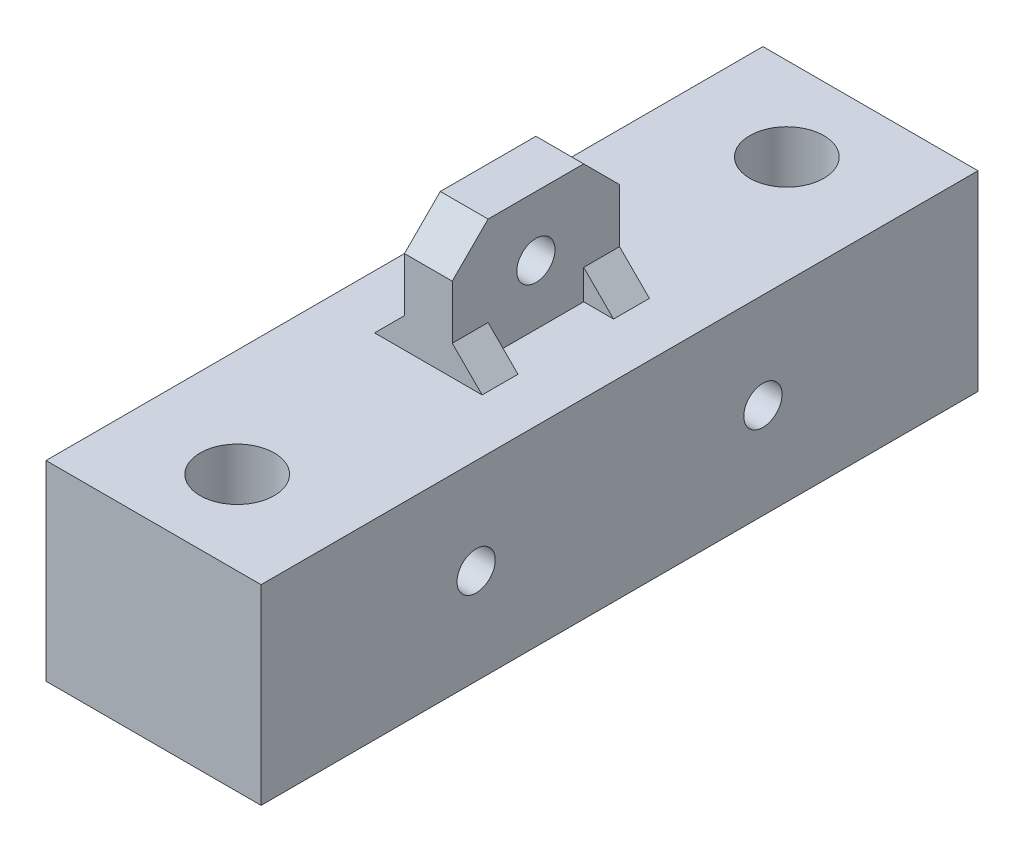
ISO-10303-21;
HEADER;
FILE_DESCRIPTION(('STEP AP214'),'2;1');
FILE_NAME('part.step','',(''),(''),'','','');
FILE_SCHEMA(('AUTOMOTIVE_DESIGN { 1 0 10303 214 1 1 1 1 }'));
ENDSEC;
DATA;
#1=APPLICATION_CONTEXT('core data for automotive mechanical design processes');
#2=APPLICATION_PROTOCOL_DEFINITION('international standard','automotive_design',2000,#1);
#3=PRODUCT_CONTEXT('',#1,'mechanical');
#4=PRODUCT('Part','Part','',(#3));
#5=PRODUCT_RELATED_PRODUCT_CATEGORY('part','',(#4));
#6=PRODUCT_DEFINITION_FORMATION('','',#4);
#7=PRODUCT_DEFINITION_CONTEXT('part definition',#1,'design');
#8=PRODUCT_DEFINITION('design','',#6,#7);
#9=PRODUCT_DEFINITION_SHAPE('','',#8);
#10=(LENGTH_UNIT() NAMED_UNIT(*) SI_UNIT(.MILLI.,.METRE.));
#11=(NAMED_UNIT(*) PLANE_ANGLE_UNIT() SI_UNIT($,.RADIAN.));
#12=(NAMED_UNIT(*) SI_UNIT($,.STERADIAN.) SOLID_ANGLE_UNIT());
#13=UNCERTAINTY_MEASURE_WITH_UNIT(LENGTH_MEASURE(1.E-05),#10,'distance_accuracy_value','');
#14=(GEOMETRIC_REPRESENTATION_CONTEXT(3) GLOBAL_UNCERTAINTY_ASSIGNED_CONTEXT((#13)) GLOBAL_UNIT_ASSIGNED_CONTEXT((#10,
#11,#12)) REPRESENTATION_CONTEXT('',''));
#15=CARTESIAN_POINT('',(0.,0.,0.));
#16=DIRECTION('',(0.,0.,1.));
#17=DIRECTION('',(1.,0.,0.));
#18=AXIS2_PLACEMENT_3D('',#15,#16,#17);
#19=CARTESIAN_POINT('',(0.,16.,0.));
#20=DIRECTION('',(0.,-1.,0.));
#21=DIRECTION('',(0.,0.,-1.));
#22=AXIS2_PLACEMENT_3D('',#19,#20,#21);
#23=PLANE('',#22);
#24=DIRECTION('',(0.,0.,-1.));
#25=VECTOR('',#24,1.);
#26=CARTESIAN_POINT('',(9.,16.,30.));
#27=LINE('',#26,#25);
#28=CARTESIAN_POINT('',(9.,16.,30.));
#29=VERTEX_POINT('',#28);
#30=CARTESIAN_POINT('',(9.,16.,-30.));
#31=VERTEX_POINT('',#30);
#32=EDGE_CURVE('E235',#29,#31,#27,.T.);
#33=ORIENTED_EDGE('',*,*,#32,.T.);
#34=DIRECTION('',(-1.,0.,0.));
#35=VECTOR('',#34,1.);
#36=CARTESIAN_POINT('',(-9.,16.,-30.));
#37=LINE('',#36,#35);
#38=CARTESIAN_POINT('',(-9.,16.,-30.));
#39=VERTEX_POINT('',#38);
#40=EDGE_CURVE('E234',#31,#39,#37,.T.);
#41=ORIENTED_EDGE('',*,*,#40,.T.);
#42=DIRECTION('',(0.,0.,1.));
#43=VECTOR('',#42,1.);
#44=CARTESIAN_POINT('',(-9.,16.,30.));
#45=LINE('',#44,#43);
#46=CARTESIAN_POINT('',(-9.,16.,30.));
#47=VERTEX_POINT('',#46);
#48=EDGE_CURVE('E236',#39,#47,#45,.T.);
#49=ORIENTED_EDGE('',*,*,#48,.T.);
#50=DIRECTION('',(1.,0.,0.));
#51=VECTOR('',#50,1.);
#52=CARTESIAN_POINT('',(-9.,16.,30.));
#53=LINE('',#52,#51);
#54=EDGE_CURVE('E238',#47,#29,#53,.T.);
#55=ORIENTED_EDGE('',*,*,#54,.T.);
#56=EDGE_LOOP('',(#33,#41,#49,#55));
#57=FACE_BOUND('',#56,.T.);
#58=CARTESIAN_POINT('',(0.,16.,23.));
#59=DIRECTION('',(0.,1.,0.));
#60=DIRECTION('',(0.,0.,1.));
#61=AXIS2_PLACEMENT_3D('',#58,#59,#60);
#62=CIRCLE('',#61,3.1);
#63=CARTESIAN_POINT('',(0.,16.,26.1));
#64=VERTEX_POINT('',#63);
#65=EDGE_CURVE('E211',#64,#64,#62,.T.);
#66=ORIENTED_EDGE('',*,*,#65,.F.);
#67=EDGE_LOOP('',(#66));
#68=FACE_BOUND('',#67,.T.);
#69=CARTESIAN_POINT('',(0.,16.,-23.));
#70=DIRECTION('',(0.,1.,0.));
#71=DIRECTION('',(0.,0.,1.));
#72=AXIS2_PLACEMENT_3D('',#69,#70,#71);
#73=CIRCLE('',#72,3.1);
#74=CARTESIAN_POINT('',(0.,16.,-19.9));
#75=VERTEX_POINT('',#74);
#76=EDGE_CURVE('E221',#75,#75,#73,.T.);
#77=ORIENTED_EDGE('',*,*,#76,.F.);
#78=EDGE_LOOP('',(#77));
#79=FACE_BOUND('',#78,.T.);
#80=DIRECTION('',(-1.,0.,0.));
#81=VECTOR('',#80,1.);
#82=CARTESIAN_POINT('',(4.5,16.,-4.));
#83=LINE('',#82,#81);
#84=CARTESIAN_POINT('',(4.5,16.,-4.));
#85=VERTEX_POINT('',#84);
#86=CARTESIAN_POINT('',(2.,16.,-4.));
#87=VERTEX_POINT('',#86);
#88=EDGE_CURVE('E168',#85,#87,#83,.T.);
#89=ORIENTED_EDGE('',*,*,#88,.T.);
#90=DIRECTION('',(0.,0.,-1.));
#91=VECTOR('',#90,1.);
#92=CARTESIAN_POINT('',(2.,16.,7.));
#93=LINE('',#92,#91);
#94=CARTESIAN_POINT('',(2.,16.,4.));
#95=VERTEX_POINT('',#94);
#96=EDGE_CURVE('E177',#95,#87,#93,.T.);
#97=ORIENTED_EDGE('',*,*,#96,.F.);
#98=DIRECTION('',(1.,0.,0.));
#99=VECTOR('',#98,1.);
#100=CARTESIAN_POINT('',(4.5,16.,4.));
#101=LINE('',#100,#99);
#102=CARTESIAN_POINT('',(4.5,16.,4.));
#103=VERTEX_POINT('',#102);
#104=EDGE_CURVE('E326',#95,#103,#101,.T.);
#105=ORIENTED_EDGE('',*,*,#104,.T.);
#106=DIRECTION('',(0.,0.,1.));
#107=VECTOR('',#106,1.);
#108=CARTESIAN_POINT('',(4.5,16.,4.));
#109=LINE('',#108,#107);
#110=CARTESIAN_POINT('',(4.5,16.,7.));
#111=VERTEX_POINT('',#110);
#112=EDGE_CURVE('E332',#103,#111,#109,.T.);
#113=ORIENTED_EDGE('',*,*,#112,.T.);
#114=DIRECTION('',(1.,0.,0.));
#115=VECTOR('',#114,1.);
#116=CARTESIAN_POINT('',(-2.,16.,7.));
#117=LINE('',#116,#115);
#118=CARTESIAN_POINT('',(-4.5,16.,7.));
#119=VERTEX_POINT('',#118);
#120=EDGE_CURVE('E190',#119,#111,#117,.T.);
#121=ORIENTED_EDGE('',*,*,#120,.F.);
#122=DIRECTION('',(0.,0.,1.));
#123=VECTOR('',#122,1.);
#124=CARTESIAN_POINT('',(-4.5,16.,4.));
#125=LINE('',#124,#123);
#126=CARTESIAN_POINT('',(-4.5,16.,4.));
#127=VERTEX_POINT('',#126);
#128=EDGE_CURVE('E346',#127,#119,#125,.T.);
#129=ORIENTED_EDGE('',*,*,#128,.F.);
#130=DIRECTION('',(1.,0.,0.));
#131=VECTOR('',#130,1.);
#132=CARTESIAN_POINT('',(-4.5,16.,4.));
#133=LINE('',#132,#131);
#134=CARTESIAN_POINT('',(-2.,16.,4.));
#135=VERTEX_POINT('',#134);
#136=EDGE_CURVE('E308',#127,#135,#133,.T.);
#137=ORIENTED_EDGE('',*,*,#136,.T.);
#138=DIRECTION('',(0.,0.,-1.));
#139=VECTOR('',#138,1.);
#140=CARTESIAN_POINT('',(-2.,16.,7.));
#141=LINE('',#140,#139);
#142=CARTESIAN_POINT('',(-2.,16.,-4.));
#143=VERTEX_POINT('',#142);
#144=EDGE_CURVE('E195',#135,#143,#141,.T.);
#145=ORIENTED_EDGE('',*,*,#144,.T.);
#146=DIRECTION('',(-1.,0.,0.));
#147=VECTOR('',#146,1.);
#148=CARTESIAN_POINT('',(-2.,16.,-4.));
#149=LINE('',#148,#147);
#150=CARTESIAN_POINT('',(-4.5,16.,-4.));
#151=VERTEX_POINT('',#150);
#152=EDGE_CURVE('E57',#143,#151,#149,.T.);
#153=ORIENTED_EDGE('',*,*,#152,.T.);
#154=DIRECTION('',(0.,0.,-1.));
#155=VECTOR('',#154,1.);
#156=CARTESIAN_POINT('',(-4.5,16.,-4.));
#157=LINE('',#156,#155);
#158=CARTESIAN_POINT('',(-4.5,16.,-7.));
#159=VERTEX_POINT('',#158);
#160=EDGE_CURVE('E320',#151,#159,#157,.T.);
#161=ORIENTED_EDGE('',*,*,#160,.T.);
#162=DIRECTION('',(1.,0.,0.));
#163=VECTOR('',#162,1.);
#164=CARTESIAN_POINT('',(-2.,16.,-7.));
#165=LINE('',#164,#163);
#166=CARTESIAN_POINT('',(4.5,16.,-7.));
#167=VERTEX_POINT('',#166);
#168=EDGE_CURVE('E63',#159,#167,#165,.T.);
#169=ORIENTED_EDGE('',*,*,#168,.T.);
#170=DIRECTION('',(0.,0.,-1.));
#171=VECTOR('',#170,1.);
#172=CARTESIAN_POINT('',(4.5,16.,-4.));
#173=LINE('',#172,#171);
#174=EDGE_CURVE('E185',#85,#167,#173,.T.);
#175=ORIENTED_EDGE('',*,*,#174,.F.);
#176=EDGE_LOOP('',(#89,#97,#105,#113,#121,#129,#137,#145,#153,#161,#169,#175));
#177=FACE_BOUND('',#176,.T.);
#178=ADVANCED_FACE('F37',(#57,#68,#79,#177),#23,.F.);
#179=CARTESIAN_POINT('',(9.,16.,30.));
#180=DIRECTION('',(-1.,0.,0.));
#181=DIRECTION('',(0.,0.,1.));
#182=AXIS2_PLACEMENT_3D('',#179,#180,#181);
#183=PLANE('',#182);
#184=CARTESIAN_POINT('',(9.,8.,-12.));
#185=DIRECTION('',(-1.,0.,0.));
#186=DIRECTION('',(0.,0.,1.));
#187=AXIS2_PLACEMENT_3D('',#184,#185,#186);
#188=CIRCLE('',#187,1.6);
#189=CARTESIAN_POINT('',(9.,8.,-10.4));
#190=VERTEX_POINT('',#189);
#191=EDGE_CURVE('E208',#190,#190,#188,.T.);
#192=ORIENTED_EDGE('',*,*,#191,.T.);
#193=EDGE_LOOP('',(#192));
#194=FACE_BOUND('',#193,.T.);
#195=CARTESIAN_POINT('',(9.,8.,12.));
#196=DIRECTION('',(-1.,0.,0.));
#197=DIRECTION('',(0.,0.,1.));
#198=AXIS2_PLACEMENT_3D('',#195,#196,#197);
#199=CIRCLE('',#198,1.6);
#200=CARTESIAN_POINT('',(9.,8.,13.6));
#201=VERTEX_POINT('',#200);
#202=EDGE_CURVE('E214',#201,#201,#199,.T.);
#203=ORIENTED_EDGE('',*,*,#202,.T.);
#204=EDGE_LOOP('',(#203));
#205=FACE_BOUND('',#204,.T.);
#206=DIRECTION('',(0.,0.,-1.));
#207=VECTOR('',#206,1.);
#208=CARTESIAN_POINT('',(9.,0.,30.));
#209=LINE('',#208,#207);
#210=CARTESIAN_POINT('',(9.,0.,30.));
#211=VERTEX_POINT('',#210);
#212=CARTESIAN_POINT('',(9.,0.,-30.));
#213=VERTEX_POINT('',#212);
#214=EDGE_CURVE('E224',#211,#213,#209,.T.);
#215=ORIENTED_EDGE('',*,*,#214,.T.);
#216=DIRECTION('',(0.,-1.,0.));
#217=VECTOR('',#216,1.);
#218=CARTESIAN_POINT('',(9.,16.,-30.));
#219=LINE('',#218,#217);
#220=EDGE_CURVE('E256',#31,#213,#219,.T.);
#221=ORIENTED_EDGE('',*,*,#220,.F.);
#222=ORIENTED_EDGE('',*,*,#32,.F.);
#223=DIRECTION('',(0.,-1.,0.));
#224=VECTOR('',#223,1.);
#225=CARTESIAN_POINT('',(9.,16.,30.));
#226=LINE('',#225,#224);
#227=EDGE_CURVE('E241',#29,#211,#226,.T.);
#228=ORIENTED_EDGE('',*,*,#227,.T.);
#229=EDGE_LOOP('',(#215,#221,#222,#228));
#230=FACE_BOUND('',#229,.T.);
#231=ADVANCED_FACE('F373',(#194,#205,#230),#183,.F.);
#232=CARTESIAN_POINT('',(-9.,16.,-30.));
#233=DIRECTION('',(0.,0.,1.));
#234=DIRECTION('',(1.,0.,0.));
#235=AXIS2_PLACEMENT_3D('',#232,#233,#234);
#236=PLANE('',#235);
#237=DIRECTION('',(-1.,0.,0.));
#238=VECTOR('',#237,1.);
#239=CARTESIAN_POINT('',(-9.,0.,-30.));
#240=LINE('',#239,#238);
#241=CARTESIAN_POINT('',(-9.,0.,-30.));
#242=VERTEX_POINT('',#241);
#243=EDGE_CURVE('E242',#213,#242,#240,.T.);
#244=ORIENTED_EDGE('',*,*,#243,.T.);
#245=DIRECTION('',(0.,-1.,0.));
#246=VECTOR('',#245,1.);
#247=CARTESIAN_POINT('',(-9.,16.,-30.));
#248=LINE('',#247,#246);
#249=EDGE_CURVE('E254',#39,#242,#248,.T.);
#250=ORIENTED_EDGE('',*,*,#249,.F.);
#251=ORIENTED_EDGE('',*,*,#40,.F.);
#252=ORIENTED_EDGE('',*,*,#220,.T.);
#253=EDGE_LOOP('',(#244,#250,#251,#252));
#254=FACE_BOUND('',#253,.T.);
#255=ADVANCED_FACE('F379',(#254),#236,.F.);
#256=CARTESIAN_POINT('',(-9.,16.,30.));
#257=DIRECTION('',(1.,0.,0.));
#258=DIRECTION('',(0.,0.,-1.));
#259=AXIS2_PLACEMENT_3D('',#256,#257,#258);
#260=PLANE('',#259);
#261=CARTESIAN_POINT('',(-9.,8.,-12.));
#262=DIRECTION('',(-1.,0.,0.));
#263=DIRECTION('',(0.,0.,1.));
#264=AXIS2_PLACEMENT_3D('',#261,#262,#263);
#265=CIRCLE('',#264,1.6);
#266=CARTESIAN_POINT('',(-9.,8.,-10.4));
#267=VERTEX_POINT('',#266);
#268=EDGE_CURVE('E215',#267,#267,#265,.T.);
#269=ORIENTED_EDGE('',*,*,#268,.F.);
#270=EDGE_LOOP('',(#269));
#271=FACE_BOUND('',#270,.T.);
#272=CARTESIAN_POINT('',(-9.,8.,12.));
#273=DIRECTION('',(-1.,0.,0.));
#274=DIRECTION('',(0.,0.,1.));
#275=AXIS2_PLACEMENT_3D('',#272,#273,#274);
#276=CIRCLE('',#275,1.6);
#277=CARTESIAN_POINT('',(-9.,8.,13.6));
#278=VERTEX_POINT('',#277);
#279=EDGE_CURVE('E200',#278,#278,#276,.T.);
#280=ORIENTED_EDGE('',*,*,#279,.F.);
#281=EDGE_LOOP('',(#280));
#282=FACE_BOUND('',#281,.T.);
#283=DIRECTION('',(0.,0.,1.));
#284=VECTOR('',#283,1.);
#285=CARTESIAN_POINT('',(-9.,0.,30.));
#286=LINE('',#285,#284);
#287=CARTESIAN_POINT('',(-9.,0.,30.));
#288=VERTEX_POINT('',#287);
#289=EDGE_CURVE('E250',#242,#288,#286,.T.);
#290=ORIENTED_EDGE('',*,*,#289,.T.);
#291=DIRECTION('',(0.,-1.,0.));
#292=VECTOR('',#291,1.);
#293=CARTESIAN_POINT('',(-9.,16.,30.));
#294=LINE('',#293,#292);
#295=EDGE_CURVE('E252',#47,#288,#294,.T.);
#296=ORIENTED_EDGE('',*,*,#295,.F.);
#297=ORIENTED_EDGE('',*,*,#48,.F.);
#298=ORIENTED_EDGE('',*,*,#249,.T.);
#299=EDGE_LOOP('',(#290,#296,#297,#298));
#300=FACE_BOUND('',#299,.T.);
#301=ADVANCED_FACE('F394',(#271,#282,#300),#260,.F.);
#302=CARTESIAN_POINT('',(-9.,16.,30.));
#303=DIRECTION('',(0.,0.,-1.));
#304=DIRECTION('',(-1.,0.,0.));
#305=AXIS2_PLACEMENT_3D('',#302,#303,#304);
#306=PLANE('',#305);
#307=DIRECTION('',(1.,0.,0.));
#308=VECTOR('',#307,1.);
#309=CARTESIAN_POINT('',(-9.,0.,30.));
#310=LINE('',#309,#308);
#311=EDGE_CURVE('E237',#288,#211,#310,.T.);
#312=ORIENTED_EDGE('',*,*,#311,.T.);
#313=ORIENTED_EDGE('',*,*,#227,.F.);
#314=ORIENTED_EDGE('',*,*,#54,.F.);
#315=ORIENTED_EDGE('',*,*,#295,.T.);
#316=EDGE_LOOP('',(#312,#313,#314,#315));
#317=FACE_BOUND('',#316,.T.);
#318=ADVANCED_FACE('F391',(#317),#306,.F.);
#319=CARTESIAN_POINT('',(0.,0.,0.));
#320=DIRECTION('',(0.,-1.,0.));
#321=DIRECTION('',(0.,0.,-1.));
#322=AXIS2_PLACEMENT_3D('',#319,#320,#321);
#323=PLANE('',#322);
#324=CARTESIAN_POINT('',(0.,0.,-23.));
#325=DIRECTION('',(0.,1.,0.));
#326=DIRECTION('',(0.,0.,1.));
#327=AXIS2_PLACEMENT_3D('',#324,#325,#326);
#328=CIRCLE('',#327,3.1);
#329=CARTESIAN_POINT('',(0.,0.,-19.9));
#330=VERTEX_POINT('',#329);
#331=EDGE_CURVE('E219',#330,#330,#328,.T.);
#332=ORIENTED_EDGE('',*,*,#331,.T.);
#333=EDGE_LOOP('',(#332));
#334=FACE_BOUND('',#333,.T.);
#335=CARTESIAN_POINT('',(0.,0.,23.));
#336=DIRECTION('',(0.,1.,0.));
#337=DIRECTION('',(0.,0.,1.));
#338=AXIS2_PLACEMENT_3D('',#335,#336,#337);
#339=CIRCLE('',#338,3.1);
#340=CARTESIAN_POINT('',(0.,0.,26.1));
#341=VERTEX_POINT('',#340);
#342=EDGE_CURVE('E230',#341,#341,#339,.T.);
#343=ORIENTED_EDGE('',*,*,#342,.T.);
#344=EDGE_LOOP('',(#343));
#345=FACE_BOUND('',#344,.T.);
#346=ORIENTED_EDGE('',*,*,#214,.F.);
#347=ORIENTED_EDGE('',*,*,#311,.F.);
#348=ORIENTED_EDGE('',*,*,#289,.F.);
#349=ORIENTED_EDGE('',*,*,#243,.F.);
#350=EDGE_LOOP('',(#346,#347,#348,#349));
#351=FACE_BOUND('',#350,.T.);
#352=ADVANCED_FACE('F389',(#334,#345,#351),#323,.T.);
#353=CARTESIAN_POINT('',(0.,0.,23.));
#354=DIRECTION('',(0.,1.,0.));
#355=DIRECTION('',(0.,0.,1.));
#356=AXIS2_PLACEMENT_3D('',#353,#354,#355);
#357=CYLINDRICAL_SURFACE('',#356,3.1);
#358=ORIENTED_EDGE('',*,*,#342,.F.);
#359=EDGE_LOOP('',(#358));
#360=FACE_BOUND('',#359,.T.);
#361=ORIENTED_EDGE('',*,*,#65,.T.);
#362=EDGE_LOOP('',(#361));
#363=FACE_BOUND('',#362,.T.);
#364=ADVANCED_FACE('F387',(#360,#363),#357,.F.);
#365=CARTESIAN_POINT('',(0.,0.,-23.));
#366=DIRECTION('',(0.,1.,0.));
#367=DIRECTION('',(0.,0.,1.));
#368=AXIS2_PLACEMENT_3D('',#365,#366,#367);
#369=CYLINDRICAL_SURFACE('',#368,3.1);
#370=ORIENTED_EDGE('',*,*,#331,.F.);
#371=EDGE_LOOP('',(#370));
#372=FACE_BOUND('',#371,.T.);
#373=ORIENTED_EDGE('',*,*,#76,.T.);
#374=EDGE_LOOP('',(#373));
#375=FACE_BOUND('',#374,.T.);
#376=ADVANCED_FACE('F532',(#372,#375),#369,.F.);
#377=CARTESIAN_POINT('',(9.,8.,12.));
#378=DIRECTION('',(-1.,0.,0.));
#379=DIRECTION('',(0.,0.,1.));
#380=AXIS2_PLACEMENT_3D('',#377,#378,#379);
#381=CYLINDRICAL_SURFACE('',#380,1.6);
#382=ORIENTED_EDGE('',*,*,#202,.F.);
#383=EDGE_LOOP('',(#382));
#384=FACE_BOUND('',#383,.T.);
#385=ORIENTED_EDGE('',*,*,#279,.T.);
#386=EDGE_LOOP('',(#385));
#387=FACE_BOUND('',#386,.T.);
#388=ADVANCED_FACE('F369',(#384,#387),#381,.F.);
#389=CARTESIAN_POINT('',(9.,8.,-12.));
#390=DIRECTION('',(-1.,0.,0.));
#391=DIRECTION('',(0.,0.,1.));
#392=AXIS2_PLACEMENT_3D('',#389,#390,#391);
#393=CYLINDRICAL_SURFACE('',#392,1.6);
#394=ORIENTED_EDGE('',*,*,#191,.F.);
#395=EDGE_LOOP('',(#394));
#396=FACE_BOUND('',#395,.T.);
#397=ORIENTED_EDGE('',*,*,#268,.T.);
#398=EDGE_LOOP('',(#397));
#399=FACE_BOUND('',#398,.T.);
#400=ADVANCED_FACE('F359',(#396,#399),#393,.F.);
#401=CARTESIAN_POINT('',(-2.,26.,7.));
#402=DIRECTION('',(-1.,0.,0.));
#403=DIRECTION('',(0.,0.,1.));
#404=AXIS2_PLACEMENT_3D('',#401,#402,#403);
#405=PLANE('',#404);
#406=DIRECTION('',(0.,0.,-1.));
#407=VECTOR('',#406,1.);
#408=CARTESIAN_POINT('',(-2.,18.5,-4.));
#409=LINE('',#408,#407);
#410=CARTESIAN_POINT('',(-2.,18.5,-4.));
#411=VERTEX_POINT('',#410);
#412=CARTESIAN_POINT('',(-2.,18.5,-7.));
#413=VERTEX_POINT('',#412);
#414=EDGE_CURVE('E312',#411,#413,#409,.T.);
#415=ORIENTED_EDGE('',*,*,#414,.F.);
#416=DIRECTION('',(0.,-1.,0.));
#417=VECTOR('',#416,1.);
#418=CARTESIAN_POINT('',(-2.,18.5,-4.));
#419=LINE('',#418,#417);
#420=EDGE_CURVE('E315',#411,#143,#419,.T.);
#421=ORIENTED_EDGE('',*,*,#420,.T.);
#422=ORIENTED_EDGE('',*,*,#144,.F.);
#423=DIRECTION('',(0.,1.,0.));
#424=VECTOR('',#423,1.);
#425=CARTESIAN_POINT('',(-2.,16.,4.));
#426=LINE('',#425,#424);
#427=CARTESIAN_POINT('',(-2.,18.5,4.));
#428=VERTEX_POINT('',#427);
#429=EDGE_CURVE('E339',#135,#428,#426,.T.);
#430=ORIENTED_EDGE('',*,*,#429,.T.);
#431=DIRECTION('',(0.,0.,1.));
#432=VECTOR('',#431,1.);
#433=CARTESIAN_POINT('',(-2.,18.5,4.));
#434=LINE('',#433,#432);
#435=CARTESIAN_POINT('',(-2.,18.5,7.));
#436=VERTEX_POINT('',#435);
#437=EDGE_CURVE('E344',#428,#436,#434,.T.);
#438=ORIENTED_EDGE('',*,*,#437,.T.);
#439=DIRECTION('',(0.,-1.,0.));
#440=VECTOR('',#439,1.);
#441=CARTESIAN_POINT('',(-2.,26.,7.));
#442=LINE('',#441,#440);
#443=CARTESIAN_POINT('',(-2.,23.,7.));
#444=VERTEX_POINT('',#443);
#445=EDGE_CURVE('E198',#444,#436,#442,.T.);
#446=ORIENTED_EDGE('',*,*,#445,.F.);
#447=DIRECTION('',(0.,-0.707106781186549,0.707106781186546));
#448=VECTOR('',#447,1.);
#449=CARTESIAN_POINT('',(-2.,24.5,5.49999999999999));
#450=LINE('',#449,#448);
#451=CARTESIAN_POINT('',(-2.,26.,4.));
#452=VERTEX_POINT('',#451);
#453=EDGE_CURVE('E280',#444,#452,#450,.F.);
#454=ORIENTED_EDGE('',*,*,#453,.T.);
#455=DIRECTION('',(0.,0.,-1.));
#456=VECTOR('',#455,1.);
#457=CARTESIAN_POINT('',(-2.,26.,7.));
#458=LINE('',#457,#456);
#459=CARTESIAN_POINT('',(-2.,26.,-3.99999999999998));
#460=VERTEX_POINT('',#459);
#461=EDGE_CURVE('E187',#452,#460,#458,.T.);
#462=ORIENTED_EDGE('',*,*,#461,.T.);
#463=DIRECTION('',(0.,-0.707106781186546,-0.707106781186549));
#464=VECTOR('',#463,1.);
#465=CARTESIAN_POINT('',(-2.,31.5,1.50000000000004));
#466=LINE('',#465,#464);
#467=CARTESIAN_POINT('',(-2.,23.,-7.));
#468=VERTEX_POINT('',#467);
#469=EDGE_CURVE('E47',#460,#468,#466,.T.);
#470=ORIENTED_EDGE('',*,*,#469,.T.);
#471=DIRECTION('',(0.,-1.,0.));
#472=VECTOR('',#471,1.);
#473=CARTESIAN_POINT('',(-2.,26.,-7.));
#474=LINE('',#473,#472);
#475=EDGE_CURVE('E202',#468,#413,#474,.T.);
#476=ORIENTED_EDGE('',*,*,#475,.T.);
#477=EDGE_LOOP('',(#415,#421,#422,#430,#438,#446,#454,#462,#470,#476));
#478=FACE_BOUND('',#477,.T.);
#479=CARTESIAN_POINT('',(-2.,21.,0.));
#480=DIRECTION('',(-1.,0.,0.));
#481=DIRECTION('',(0.,0.,1.));
#482=AXIS2_PLACEMENT_3D('',#479,#480,#481);
#483=CIRCLE('',#482,1.6);
#484=CARTESIAN_POINT('',(-2.,21.,1.6));
#485=VERTEX_POINT('',#484);
#486=EDGE_CURVE('E264',#485,#485,#483,.T.);
#487=ORIENTED_EDGE('',*,*,#486,.F.);
#488=EDGE_LOOP('',(#487));
#489=FACE_BOUND('',#488,.T.);
#490=ADVANCED_FACE('F285',(#478,#489),#405,.T.);
#491=CARTESIAN_POINT('',(-2.,26.,7.));
#492=DIRECTION('',(0.,0.,-1.));
#493=DIRECTION('',(-1.,0.,0.));
#494=AXIS2_PLACEMENT_3D('',#491,#492,#493);
#495=PLANE('',#494);
#496=DIRECTION('',(0.,-1.,0.));
#497=VECTOR('',#496,1.);
#498=CARTESIAN_POINT('',(2.,26.,7.));
#499=LINE('',#498,#497);
#500=CARTESIAN_POINT('',(2.,23.,7.));
#501=VERTEX_POINT('',#500);
#502=CARTESIAN_POINT('',(2.,18.5,7.));
#503=VERTEX_POINT('',#502);
#504=EDGE_CURVE('E199',#501,#503,#499,.T.);
#505=ORIENTED_EDGE('',*,*,#504,.F.);
#506=DIRECTION('',(-1.,0.,0.));
#507=VECTOR('',#506,1.);
#508=CARTESIAN_POINT('',(-2.,23.,7.));
#509=LINE('',#508,#507);
#510=EDGE_CURVE('E11',#501,#444,#509,.T.);
#511=ORIENTED_EDGE('',*,*,#510,.T.);
#512=ORIENTED_EDGE('',*,*,#445,.T.);
#513=DIRECTION('',(-0.707106781186548,-0.707106781186547,0.));
#514=VECTOR('',#513,1.);
#515=CARTESIAN_POINT('',(-2.,18.5,7.));
#516=LINE('',#515,#514);
#517=EDGE_CURVE('E340',#436,#119,#516,.T.);
#518=ORIENTED_EDGE('',*,*,#517,.T.);
#519=ORIENTED_EDGE('',*,*,#120,.T.);
#520=DIRECTION('',(-0.707106781186547,0.707106781186548,0.));
#521=VECTOR('',#520,1.);
#522=CARTESIAN_POINT('',(2.,18.5,7.));
#523=LINE('',#522,#521);
#524=EDGE_CURVE('E323',#111,#503,#523,.T.);
#525=ORIENTED_EDGE('',*,*,#524,.T.);
#526=EDGE_LOOP('',(#505,#511,#512,#518,#519,#525));
#527=FACE_BOUND('',#526,.T.);
#528=ADVANCED_FACE('F358',(#527),#495,.F.);
#529=CARTESIAN_POINT('',(2.,26.,7.));
#530=DIRECTION('',(-1.,0.,0.));
#531=DIRECTION('',(0.,0.,1.));
#532=AXIS2_PLACEMENT_3D('',#529,#530,#531);
#533=PLANE('',#532);
#534=CARTESIAN_POINT('',(2.,21.,0.));
#535=DIRECTION('',(-1.,0.,0.));
#536=DIRECTION('',(0.,0.,1.));
#537=AXIS2_PLACEMENT_3D('',#534,#535,#536);
#538=CIRCLE('',#537,1.6);
#539=CARTESIAN_POINT('',(2.,21.,1.6));
#540=VERTEX_POINT('',#539);
#541=EDGE_CURVE('E265',#540,#540,#538,.T.);
#542=ORIENTED_EDGE('',*,*,#541,.T.);
#543=EDGE_LOOP('',(#542));
#544=FACE_BOUND('',#543,.T.);
#545=DIRECTION('',(0.,1.,0.));
#546=VECTOR('',#545,1.);
#547=CARTESIAN_POINT('',(2.,16.,-4.));
#548=LINE('',#547,#546);
#549=CARTESIAN_POINT('',(2.,18.5,-4.));
#550=VERTEX_POINT('',#549);
#551=EDGE_CURVE('E170',#87,#550,#548,.T.);
#552=ORIENTED_EDGE('',*,*,#551,.T.);
#553=DIRECTION('',(0.,0.,-1.));
#554=VECTOR('',#553,1.);
#555=CARTESIAN_POINT('',(2.,18.5,-4.));
#556=LINE('',#555,#554);
#557=CARTESIAN_POINT('',(2.,18.5,-7.));
#558=VERTEX_POINT('',#557);
#559=EDGE_CURVE('E596',#550,#558,#556,.T.);
#560=ORIENTED_EDGE('',*,*,#559,.T.);
#561=DIRECTION('',(0.,-1.,0.));
#562=VECTOR('',#561,1.);
#563=CARTESIAN_POINT('',(2.,26.,-7.));
#564=LINE('',#563,#562);
#565=CARTESIAN_POINT('',(2.,23.,-7.));
#566=VERTEX_POINT('',#565);
#567=EDGE_CURVE('E205',#566,#558,#564,.T.);
#568=ORIENTED_EDGE('',*,*,#567,.F.);
#569=DIRECTION('',(0.,0.707106781186546,0.707106781186549));
#570=VECTOR('',#569,1.);
#571=CARTESIAN_POINT('',(2.,23.,-7.));
#572=LINE('',#571,#570);
#573=CARTESIAN_POINT('',(2.,26.,-3.99999999999998));
#574=VERTEX_POINT('',#573);
#575=EDGE_CURVE('E269',#566,#574,#572,.T.);
#576=ORIENTED_EDGE('',*,*,#575,.T.);
#577=DIRECTION('',(0.,0.,-1.));
#578=VECTOR('',#577,1.);
#579=CARTESIAN_POINT('',(2.,26.,7.));
#580=LINE('',#579,#578);
#581=CARTESIAN_POINT('',(2.,26.,4.));
#582=VERTEX_POINT('',#581);
#583=EDGE_CURVE('E210',#582,#574,#580,.T.);
#584=ORIENTED_EDGE('',*,*,#583,.F.);
#585=DIRECTION('',(0.,0.707106781186549,-0.707106781186546));
#586=VECTOR('',#585,1.);
#587=CARTESIAN_POINT('',(2.,26.,4.));
#588=LINE('',#587,#586);
#589=EDGE_CURVE('E268',#582,#501,#588,.F.);
#590=ORIENTED_EDGE('',*,*,#589,.T.);
#591=ORIENTED_EDGE('',*,*,#504,.T.);
#592=DIRECTION('',(0.,0.,1.));
#593=VECTOR('',#592,1.);
#594=CARTESIAN_POINT('',(2.,18.5,4.));
#595=LINE('',#594,#593);
#596=CARTESIAN_POINT('',(2.,18.5,4.));
#597=VERTEX_POINT('',#596);
#598=EDGE_CURVE('E331',#597,#503,#595,.T.);
#599=ORIENTED_EDGE('',*,*,#598,.F.);
#600=DIRECTION('',(0.,-1.,0.));
#601=VECTOR('',#600,1.);
#602=CARTESIAN_POINT('',(2.,16.,4.));
#603=LINE('',#602,#601);
#604=EDGE_CURVE('E186',#597,#95,#603,.T.);
#605=ORIENTED_EDGE('',*,*,#604,.T.);
#606=ORIENTED_EDGE('',*,*,#96,.T.);
#607=EDGE_LOOP('',(#552,#560,#568,#576,#584,#590,#591,#599,#605,#606));
#608=FACE_BOUND('',#607,.T.);
#609=ADVANCED_FACE('F183',(#544,#608),#533,.F.);
#610=CARTESIAN_POINT('',(-2.,26.,-7.));
#611=DIRECTION('',(0.,0.,-1.));
#612=DIRECTION('',(-1.,0.,0.));
#613=AXIS2_PLACEMENT_3D('',#610,#611,#612);
#614=PLANE('',#613);
#615=ORIENTED_EDGE('',*,*,#475,.F.);
#616=DIRECTION('',(1.,0.,0.));
#617=VECTOR('',#616,1.);
#618=CARTESIAN_POINT('',(2.,23.,-7.));
#619=LINE('',#618,#617);
#620=EDGE_CURVE('E261',#468,#566,#619,.T.);
#621=ORIENTED_EDGE('',*,*,#620,.T.);
#622=ORIENTED_EDGE('',*,*,#567,.T.);
#623=DIRECTION('',(0.707106781186547,-0.707106781186548,0.));
#624=VECTOR('',#623,1.);
#625=CARTESIAN_POINT('',(2.,18.5,-7.));
#626=LINE('',#625,#624);
#627=EDGE_CURVE('E181',#558,#167,#626,.T.);
#628=ORIENTED_EDGE('',*,*,#627,.T.);
#629=ORIENTED_EDGE('',*,*,#168,.F.);
#630=DIRECTION('',(0.707106781186548,0.707106781186547,0.));
#631=VECTOR('',#630,1.);
#632=CARTESIAN_POINT('',(-4.5,16.,-7.));
#633=LINE('',#632,#631);
#634=EDGE_CURVE('E295',#159,#413,#633,.T.);
#635=ORIENTED_EDGE('',*,*,#634,.T.);
#636=EDGE_LOOP('',(#615,#621,#622,#628,#629,#635));
#637=FACE_BOUND('',#636,.T.);
#638=ADVANCED_FACE('F287',(#637),#614,.T.);
#639=CARTESIAN_POINT('',(0.,26.,0.));
#640=DIRECTION('',(0.,-1.,0.));
#641=DIRECTION('',(0.,0.,-1.));
#642=AXIS2_PLACEMENT_3D('',#639,#640,#641);
#643=PLANE('',#642);
#644=ORIENTED_EDGE('',*,*,#583,.T.);
#645=DIRECTION('',(-1.,0.,0.));
#646=VECTOR('',#645,1.);
#647=CARTESIAN_POINT('',(-2.,26.,-3.99999999999998));
#648=LINE('',#647,#646);
#649=EDGE_CURVE('E274',#574,#460,#648,.T.);
#650=ORIENTED_EDGE('',*,*,#649,.T.);
#651=ORIENTED_EDGE('',*,*,#461,.F.);
#652=DIRECTION('',(1.,0.,0.));
#653=VECTOR('',#652,1.);
#654=CARTESIAN_POINT('',(0.,26.,4.));
#655=LINE('',#654,#653);
#656=EDGE_CURVE('E275',#452,#582,#655,.T.);
#657=ORIENTED_EDGE('',*,*,#656,.T.);
#658=EDGE_LOOP('',(#644,#650,#651,#657));
#659=FACE_BOUND('',#658,.T.);
#660=ADVANCED_FACE('F296',(#659),#643,.F.);
#661=CARTESIAN_POINT('',(9.,21.,0.));
#662=DIRECTION('',(-1.,0.,0.));
#663=DIRECTION('',(0.,0.,1.));
#664=AXIS2_PLACEMENT_3D('',#661,#662,#663);
#665=CYLINDRICAL_SURFACE('',#664,1.6);
#666=ORIENTED_EDGE('',*,*,#486,.T.);
#667=EDGE_LOOP('',(#666));
#668=FACE_BOUND('',#667,.T.);
#669=ORIENTED_EDGE('',*,*,#541,.F.);
#670=EDGE_LOOP('',(#669));
#671=FACE_BOUND('',#670,.T.);
#672=ADVANCED_FACE('F352',(#668,#671),#665,.F.);
#673=CARTESIAN_POINT('',(-2.,23.,-7.));
#674=DIRECTION('',(0.,0.707106781186549,-0.707106781186546));
#675=DIRECTION('',(-1.,0.,0.));
#676=AXIS2_PLACEMENT_3D('',#673,#674,#675);
#677=PLANE('',#676);
#678=ORIENTED_EDGE('',*,*,#469,.F.);
#679=ORIENTED_EDGE('',*,*,#649,.F.);
#680=ORIENTED_EDGE('',*,*,#575,.F.);
#681=ORIENTED_EDGE('',*,*,#620,.F.);
#682=EDGE_LOOP('',(#678,#679,#680,#681));
#683=FACE_BOUND('',#682,.T.);
#684=ADVANCED_FACE('F291',(#683),#677,.T.);
#685=CARTESIAN_POINT('',(0.,26.,4.));
#686=DIRECTION('',(0.,-0.707106781186546,-0.707106781186549));
#687=DIRECTION('',(1.,0.,0.));
#688=AXIS2_PLACEMENT_3D('',#685,#686,#687);
#689=PLANE('',#688);
#690=ORIENTED_EDGE('',*,*,#453,.F.);
#691=ORIENTED_EDGE('',*,*,#510,.F.);
#692=ORIENTED_EDGE('',*,*,#589,.F.);
#693=ORIENTED_EDGE('',*,*,#656,.F.);
#694=EDGE_LOOP('',(#690,#691,#692,#693));
#695=FACE_BOUND('',#694,.T.);
#696=ADVANCED_FACE('F43',(#695),#689,.F.);
#697=CARTESIAN_POINT('',(-2.,18.5,4.));
#698=DIRECTION('',(-0.707106781186547,0.707106781186548,0.));
#699=DIRECTION('',(-0.707106781186548,-0.707106781186547,0.));
#700=AXIS2_PLACEMENT_3D('',#697,#698,#699);
#701=PLANE('',#700);
#702=ORIENTED_EDGE('',*,*,#517,.F.);
#703=ORIENTED_EDGE('',*,*,#437,.F.);
#704=DIRECTION('',(-0.707106781186548,-0.707106781186547,0.));
#705=VECTOR('',#704,1.);
#706=CARTESIAN_POINT('',(-2.,18.5,4.));
#707=LINE('',#706,#705);
#708=EDGE_CURVE('E345',#428,#127,#707,.T.);
#709=ORIENTED_EDGE('',*,*,#708,.T.);
#710=ORIENTED_EDGE('',*,*,#128,.T.);
#711=EDGE_LOOP('',(#702,#703,#709,#710));
#712=FACE_BOUND('',#711,.T.);
#713=ADVANCED_FACE('F407',(#712),#701,.T.);
#714=CARTESIAN_POINT('',(0.,0.,4.));
#715=DIRECTION('',(0.,0.,-1.));
#716=DIRECTION('',(-1.,0.,0.));
#717=AXIS2_PLACEMENT_3D('',#714,#715,#716);
#718=PLANE('',#717);
#719=ORIENTED_EDGE('',*,*,#429,.F.);
#720=ORIENTED_EDGE('',*,*,#136,.F.);
#721=ORIENTED_EDGE('',*,*,#708,.F.);
#722=EDGE_LOOP('',(#719,#720,#721));
#723=FACE_BOUND('',#722,.T.);
#724=ADVANCED_FACE('F465',(#723),#718,.T.);
#725=CARTESIAN_POINT('',(2.,18.5,4.));
#726=DIRECTION('',(0.707106781186548,0.707106781186547,0.));
#727=DIRECTION('',(-0.707106781186547,0.707106781186548,0.));
#728=AXIS2_PLACEMENT_3D('',#725,#726,#727);
#729=PLANE('',#728);
#730=ORIENTED_EDGE('',*,*,#524,.F.);
#731=ORIENTED_EDGE('',*,*,#112,.F.);
#732=DIRECTION('',(-0.707106781186547,0.707106781186548,0.));
#733=VECTOR('',#732,1.);
#734=CARTESIAN_POINT('',(2.,18.5,4.));
#735=LINE('',#734,#733);
#736=EDGE_CURVE('E327',#103,#597,#735,.T.);
#737=ORIENTED_EDGE('',*,*,#736,.T.);
#738=ORIENTED_EDGE('',*,*,#598,.T.);
#739=EDGE_LOOP('',(#730,#731,#737,#738));
#740=FACE_BOUND('',#739,.T.);
#741=ADVANCED_FACE('F458',(#740),#729,.T.);
#742=CARTESIAN_POINT('',(0.,0.,4.));
#743=DIRECTION('',(0.,0.,1.));
#744=DIRECTION('',(1.,0.,0.));
#745=AXIS2_PLACEMENT_3D('',#742,#743,#744);
#746=PLANE('',#745);
#747=ORIENTED_EDGE('',*,*,#604,.F.);
#748=ORIENTED_EDGE('',*,*,#736,.F.);
#749=ORIENTED_EDGE('',*,*,#104,.F.);
#750=EDGE_LOOP('',(#747,#748,#749));
#751=FACE_BOUND('',#750,.T.);
#752=ADVANCED_FACE('F432',(#751),#746,.F.);
#753=CARTESIAN_POINT('',(-4.5,16.,-4.));
#754=DIRECTION('',(-0.707106781186547,0.707106781186548,0.));
#755=DIRECTION('',(-0.707106781186548,-0.707106781186547,0.));
#756=AXIS2_PLACEMENT_3D('',#753,#754,#755);
#757=PLANE('',#756);
#758=ORIENTED_EDGE('',*,*,#634,.F.);
#759=ORIENTED_EDGE('',*,*,#160,.F.);
#760=DIRECTION('',(0.707106781186548,0.707106781186547,0.));
#761=VECTOR('',#760,1.);
#762=CARTESIAN_POINT('',(-4.5,16.,-4.));
#763=LINE('',#762,#761);
#764=EDGE_CURVE('E314',#151,#411,#763,.T.);
#765=ORIENTED_EDGE('',*,*,#764,.T.);
#766=ORIENTED_EDGE('',*,*,#414,.T.);
#767=EDGE_LOOP('',(#758,#759,#765,#766));
#768=FACE_BOUND('',#767,.T.);
#769=ADVANCED_FACE('F431',(#768),#757,.T.);
#770=CARTESIAN_POINT('',(0.,0.,-4.));
#771=DIRECTION('',(0.,0.,-1.));
#772=DIRECTION('',(-1.,0.,0.));
#773=AXIS2_PLACEMENT_3D('',#770,#771,#772);
#774=PLANE('',#773);
#775=ORIENTED_EDGE('',*,*,#764,.F.);
#776=ORIENTED_EDGE('',*,*,#152,.F.);
#777=ORIENTED_EDGE('',*,*,#420,.F.);
#778=EDGE_LOOP('',(#775,#776,#777));
#779=FACE_BOUND('',#778,.T.);
#780=ADVANCED_FACE('F313',(#779),#774,.F.);
#781=CARTESIAN_POINT('',(2.,18.5,-4.));
#782=DIRECTION('',(0.707106781186548,0.707106781186547,0.));
#783=DIRECTION('',(-0.707106781186547,0.707106781186548,0.));
#784=AXIS2_PLACEMENT_3D('',#781,#782,#783);
#785=PLANE('',#784);
#786=ORIENTED_EDGE('',*,*,#627,.F.);
#787=ORIENTED_EDGE('',*,*,#559,.F.);
#788=DIRECTION('',(0.707106781186547,-0.707106781186548,0.));
#789=VECTOR('',#788,1.);
#790=CARTESIAN_POINT('',(2.,18.5,-4.));
#791=LINE('',#790,#789);
#792=EDGE_CURVE('E175',#550,#85,#791,.T.);
#793=ORIENTED_EDGE('',*,*,#792,.T.);
#794=ORIENTED_EDGE('',*,*,#174,.T.);
#795=EDGE_LOOP('',(#786,#787,#793,#794));
#796=FACE_BOUND('',#795,.T.);
#797=ADVANCED_FACE('F445',(#796),#785,.T.);
#798=CARTESIAN_POINT('',(0.,0.,-4.));
#799=DIRECTION('',(0.,0.,-1.));
#800=DIRECTION('',(-1.,0.,0.));
#801=AXIS2_PLACEMENT_3D('',#798,#799,#800);
#802=PLANE('',#801);
#803=ORIENTED_EDGE('',*,*,#88,.F.);
#804=ORIENTED_EDGE('',*,*,#792,.F.);
#805=ORIENTED_EDGE('',*,*,#551,.F.);
#806=EDGE_LOOP('',(#803,#804,#805));
#807=FACE_BOUND('',#806,.T.);
#808=ADVANCED_FACE('F166',(#807),#802,.F.);
#809=CLOSED_SHELL('',(#178,#231,#255,#301,#318,#352,#364,#376,#388,#400,#490,#528,#609,#638,
#660,#672,#684,#696,#713,#724,#741,#752,#769,#780,#797,#808));
#810=MANIFOLD_SOLID_BREP('B2',#809);
#811=ADVANCED_BREP_SHAPE_REPRESENTATION('',(#18,#810),#14);
#812=SHAPE_DEFINITION_REPRESENTATION(#9,#811);
ENDSEC;
END-ISO-10303-21;
